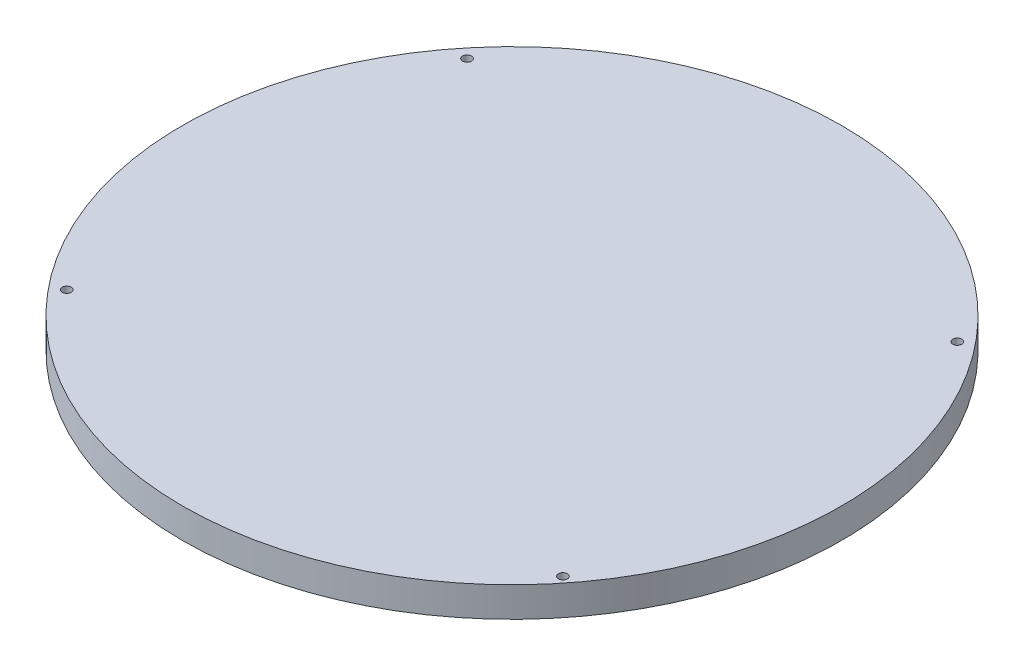
ISO-10303-21;
HEADER;
FILE_DESCRIPTION(('STEP AP214'),'2;1');
FILE_NAME('part.step','',(''),(''),'','','');
FILE_SCHEMA(('AUTOMOTIVE_DESIGN { 1 0 10303 214 1 1 1 1 }'));
ENDSEC;
DATA;
#1=APPLICATION_CONTEXT('core data for automotive mechanical design processes');
#2=APPLICATION_PROTOCOL_DEFINITION('international standard','automotive_design',2000,#1);
#3=PRODUCT_CONTEXT('',#1,'mechanical');
#4=PRODUCT('Part','Part','',(#3));
#5=PRODUCT_RELATED_PRODUCT_CATEGORY('part','',(#4));
#6=PRODUCT_DEFINITION_FORMATION('','',#4);
#7=PRODUCT_DEFINITION_CONTEXT('part definition',#1,'design');
#8=PRODUCT_DEFINITION('design','',#6,#7);
#9=PRODUCT_DEFINITION_SHAPE('','',#8);
#10=(LENGTH_UNIT() NAMED_UNIT(*) SI_UNIT(.MILLI.,.METRE.));
#11=(NAMED_UNIT(*) PLANE_ANGLE_UNIT() SI_UNIT($,.RADIAN.));
#12=(NAMED_UNIT(*) SI_UNIT($,.STERADIAN.) SOLID_ANGLE_UNIT());
#13=UNCERTAINTY_MEASURE_WITH_UNIT(LENGTH_MEASURE(1.E-05),#10,'distance_accuracy_value','');
#14=(GEOMETRIC_REPRESENTATION_CONTEXT(3) GLOBAL_UNCERTAINTY_ASSIGNED_CONTEXT((#13)) GLOBAL_UNIT_ASSIGNED_CONTEXT((#10,
#11,#12)) REPRESENTATION_CONTEXT('',''));
#15=CARTESIAN_POINT('',(0.,0.,0.));
#16=DIRECTION('',(0.,0.,1.));
#17=DIRECTION('',(1.,0.,0.));
#18=AXIS2_PLACEMENT_3D('',#15,#16,#17);
#19=CARTESIAN_POINT('',(-81.8198051533948,10.,-66.8198051533947));
#20=DIRECTION('',(0.,-1.,0.));
#21=DIRECTION('',(0.,0.,-1.));
#22=AXIS2_PLACEMENT_3D('',#19,#20,#21);
#23=CYLINDRICAL_SURFACE('',#22,1.50000000000001);
#24=CARTESIAN_POINT('',(-81.8198051533948,10.,-66.8198051533947));
#25=DIRECTION('',(0.,1.,0.));
#26=DIRECTION('',(0.,0.,1.));
#27=AXIS2_PLACEMENT_3D('',#24,#25,#26);
#28=CIRCLE('',#27,1.50000000000001);
#29=CARTESIAN_POINT('',(-81.8198051533948,10.,-65.3198051533947));
#30=VERTEX_POINT('',#29);
#31=EDGE_CURVE('E52',#30,#30,#28,.T.);
#32=ORIENTED_EDGE('',*,*,#31,.T.);
#33=EDGE_LOOP('',(#32));
#34=FACE_BOUND('',#33,.T.);
#35=CARTESIAN_POINT('',(-81.8198051533948,0.,-66.8198051533947));
#36=DIRECTION('',(0.,1.,0.));
#37=DIRECTION('',(0.,0.,1.));
#38=AXIS2_PLACEMENT_3D('',#35,#36,#37);
#39=CIRCLE('',#38,1.50000000000001);
#40=CARTESIAN_POINT('',(-81.8198051533948,0.,-65.3198051533947));
#41=VERTEX_POINT('',#40);
#42=EDGE_CURVE('E73',#41,#41,#39,.T.);
#43=ORIENTED_EDGE('',*,*,#42,.F.);
#44=EDGE_LOOP('',(#43));
#45=FACE_BOUND('',#44,.T.);
#46=ADVANCED_FACE('F43',(#34,#45),#23,.F.);
#47=CARTESIAN_POINT('',(-81.8198051533947,10.,66.8198051533948));
#48=DIRECTION('',(0.,-1.,0.));
#49=DIRECTION('',(0.,0.,-1.));
#50=AXIS2_PLACEMENT_3D('',#47,#48,#49);
#51=CYLINDRICAL_SURFACE('',#50,1.50000000000003);
#52=CARTESIAN_POINT('',(-81.8198051533947,10.,66.8198051533948));
#53=DIRECTION('',(0.,1.,0.));
#54=DIRECTION('',(0.,0.,1.));
#55=AXIS2_PLACEMENT_3D('',#52,#53,#54);
#56=CIRCLE('',#55,1.50000000000003);
#57=CARTESIAN_POINT('',(-81.8198051533947,10.,68.3198051533948));
#58=VERTEX_POINT('',#57);
#59=EDGE_CURVE('E58',#58,#58,#56,.T.);
#60=ORIENTED_EDGE('',*,*,#59,.T.);
#61=EDGE_LOOP('',(#60));
#62=FACE_BOUND('',#61,.T.);
#63=CARTESIAN_POINT('',(-81.8198051533947,0.,66.8198051533948));
#64=DIRECTION('',(0.,1.,0.));
#65=DIRECTION('',(0.,0.,1.));
#66=AXIS2_PLACEMENT_3D('',#63,#64,#65);
#67=CIRCLE('',#66,1.50000000000003);
#68=CARTESIAN_POINT('',(-81.8198051533947,0.,68.3198051533948));
#69=VERTEX_POINT('',#68);
#70=EDGE_CURVE('E70',#69,#69,#67,.T.);
#71=ORIENTED_EDGE('',*,*,#70,.F.);
#72=EDGE_LOOP('',(#71));
#73=FACE_BOUND('',#72,.T.);
#74=ADVANCED_FACE('F96',(#62,#73),#51,.F.);
#75=CARTESIAN_POINT('',(83.8198051533948,10.,66.8198051533947));
#76=DIRECTION('',(0.,-1.,0.));
#77=DIRECTION('',(0.,0.,-1.));
#78=AXIS2_PLACEMENT_3D('',#75,#76,#77);
#79=CYLINDRICAL_SURFACE('',#78,1.50000000000002);
#80=CARTESIAN_POINT('',(83.8198051533948,10.,66.8198051533947));
#81=DIRECTION('',(0.,1.,0.));
#82=DIRECTION('',(0.,0.,1.));
#83=AXIS2_PLACEMENT_3D('',#80,#81,#82);
#84=CIRCLE('',#83,1.50000000000002);
#85=CARTESIAN_POINT('',(83.8198051533948,10.,68.3198051533947));
#86=VERTEX_POINT('',#85);
#87=EDGE_CURVE('E85',#86,#86,#84,.T.);
#88=ORIENTED_EDGE('',*,*,#87,.T.);
#89=EDGE_LOOP('',(#88));
#90=FACE_BOUND('',#89,.T.);
#91=CARTESIAN_POINT('',(83.8198051533948,0.,66.8198051533947));
#92=DIRECTION('',(0.,1.,0.));
#93=DIRECTION('',(0.,0.,1.));
#94=AXIS2_PLACEMENT_3D('',#91,#92,#93);
#95=CIRCLE('',#94,1.50000000000002);
#96=CARTESIAN_POINT('',(83.8198051533948,0.,68.3198051533947));
#97=VERTEX_POINT('',#96);
#98=EDGE_CURVE('E66',#97,#97,#95,.T.);
#99=ORIENTED_EDGE('',*,*,#98,.F.);
#100=EDGE_LOOP('',(#99));
#101=FACE_BOUND('',#100,.T.);
#102=ADVANCED_FACE('F114',(#90,#101),#79,.F.);
#103=CARTESIAN_POINT('',(81.8198051533947,10.,-66.8198051533948));
#104=DIRECTION('',(0.,-1.,0.));
#105=DIRECTION('',(0.,0.,-1.));
#106=AXIS2_PLACEMENT_3D('',#103,#104,#105);
#107=CYLINDRICAL_SURFACE('',#106,1.5);
#108=CARTESIAN_POINT('',(81.8198051533947,10.,-66.8198051533948));
#109=DIRECTION('',(0.,1.,0.));
#110=DIRECTION('',(0.,0.,1.));
#111=AXIS2_PLACEMENT_3D('',#108,#109,#110);
#112=CIRCLE('',#111,1.5);
#113=CARTESIAN_POINT('',(81.8198051533947,10.,-65.3198051533948));
#114=VERTEX_POINT('',#113);
#115=EDGE_CURVE('E80',#114,#114,#112,.T.);
#116=ORIENTED_EDGE('',*,*,#115,.T.);
#117=EDGE_LOOP('',(#116));
#118=FACE_BOUND('',#117,.T.);
#119=CARTESIAN_POINT('',(81.8198051533947,0.,-66.8198051533948));
#120=DIRECTION('',(0.,1.,0.));
#121=DIRECTION('',(0.,0.,1.));
#122=AXIS2_PLACEMENT_3D('',#119,#120,#121);
#123=CIRCLE('',#122,1.5);
#124=CARTESIAN_POINT('',(81.8198051533947,0.,-65.3198051533948));
#125=VERTEX_POINT('',#124);
#126=EDGE_CURVE('E62',#125,#125,#123,.T.);
#127=ORIENTED_EDGE('',*,*,#126,.F.);
#128=EDGE_LOOP('',(#127));
#129=FACE_BOUND('',#128,.T.);
#130=ADVANCED_FACE('F45',(#118,#129),#107,.F.);
#131=CARTESIAN_POINT('',(0.,10.,0.));
#132=DIRECTION('',(0.,-1.,0.));
#133=DIRECTION('',(0.,0.,-1.));
#134=AXIS2_PLACEMENT_3D('',#131,#132,#133);
#135=CYLINDRICAL_SURFACE('',#134,110.);
#136=CARTESIAN_POINT('',(0.,10.,0.));
#137=DIRECTION('',(0.,1.,0.));
#138=DIRECTION('',(0.,0.,1.));
#139=AXIS2_PLACEMENT_3D('',#136,#137,#138);
#140=CIRCLE('',#139,110.);
#141=CARTESIAN_POINT('',(0.,10.,110.));
#142=VERTEX_POINT('',#141);
#143=EDGE_CURVE('E10',#142,#142,#140,.T.);
#144=ORIENTED_EDGE('',*,*,#143,.F.);
#145=EDGE_LOOP('',(#144));
#146=FACE_BOUND('',#145,.T.);
#147=CARTESIAN_POINT('',(0.,0.,0.));
#148=DIRECTION('',(0.,1.,0.));
#149=DIRECTION('',(0.,0.,1.));
#150=AXIS2_PLACEMENT_3D('',#147,#148,#149);
#151=CIRCLE('',#150,110.);
#152=CARTESIAN_POINT('',(0.,0.,110.));
#153=VERTEX_POINT('',#152);
#154=EDGE_CURVE('E47',#153,#153,#151,.T.);
#155=ORIENTED_EDGE('',*,*,#154,.T.);
#156=EDGE_LOOP('',(#155));
#157=FACE_BOUND('',#156,.T.);
#158=ADVANCED_FACE('F103',(#146,#157),#135,.T.);
#159=CARTESIAN_POINT('',(0.,10.,0.));
#160=DIRECTION('',(0.,1.,0.));
#161=DIRECTION('',(0.,0.,1.));
#162=AXIS2_PLACEMENT_3D('',#159,#160,#161);
#163=PLANE('',#162);
#164=ORIENTED_EDGE('',*,*,#115,.F.);
#165=EDGE_LOOP('',(#164));
#166=FACE_BOUND('',#165,.T.);
#167=ORIENTED_EDGE('',*,*,#87,.F.);
#168=EDGE_LOOP('',(#167));
#169=FACE_BOUND('',#168,.T.);
#170=ORIENTED_EDGE('',*,*,#59,.F.);
#171=EDGE_LOOP('',(#170));
#172=FACE_BOUND('',#171,.T.);
#173=ORIENTED_EDGE('',*,*,#31,.F.);
#174=EDGE_LOOP('',(#173));
#175=FACE_BOUND('',#174,.T.);
#176=ORIENTED_EDGE('',*,*,#143,.T.);
#177=EDGE_LOOP('',(#176));
#178=FACE_BOUND('',#177,.T.);
#179=ADVANCED_FACE('F99',(#166,#169,#172,#175,#178),#163,.T.);
#180=CARTESIAN_POINT('',(0.,0.,0.));
#181=DIRECTION('',(0.,1.,0.));
#182=DIRECTION('',(0.,0.,1.));
#183=AXIS2_PLACEMENT_3D('',#180,#181,#182);
#184=PLANE('',#183);
#185=ORIENTED_EDGE('',*,*,#126,.T.);
#186=EDGE_LOOP('',(#185));
#187=FACE_BOUND('',#186,.T.);
#188=ORIENTED_EDGE('',*,*,#98,.T.);
#189=EDGE_LOOP('',(#188));
#190=FACE_BOUND('',#189,.T.);
#191=ORIENTED_EDGE('',*,*,#70,.T.);
#192=EDGE_LOOP('',(#191));
#193=FACE_BOUND('',#192,.T.);
#194=ORIENTED_EDGE('',*,*,#42,.T.);
#195=EDGE_LOOP('',(#194));
#196=FACE_BOUND('',#195,.T.);
#197=ORIENTED_EDGE('',*,*,#154,.F.);
#198=EDGE_LOOP('',(#197));
#199=FACE_BOUND('',#198,.T.);
#200=ADVANCED_FACE('F102',(#187,#190,#193,#196,#199),#184,.F.);
#201=CLOSED_SHELL('',(#46,#74,#102,#130,#158,#179,#200));
#202=MANIFOLD_SOLID_BREP('B2',#201);
#203=ADVANCED_BREP_SHAPE_REPRESENTATION('',(#18,#202),#14);
#204=SHAPE_DEFINITION_REPRESENTATION(#9,#203);
ENDSEC;
END-ISO-10303-21;
